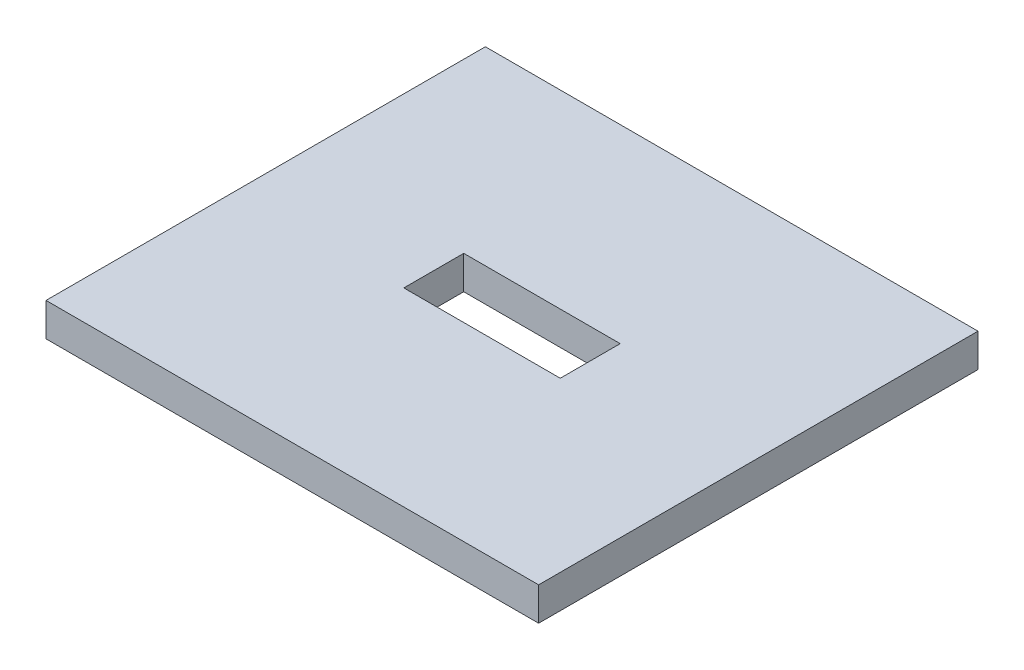
ISO-10303-21;
HEADER;
FILE_DESCRIPTION(('STEP AP214'),'2;1');
FILE_NAME('part.step','',(''),(''),'','','');
FILE_SCHEMA(('AUTOMOTIVE_DESIGN { 1 0 10303 214 1 1 1 1 }'));
ENDSEC;
DATA;
#1=APPLICATION_CONTEXT('core data for automotive mechanical design processes');
#2=APPLICATION_PROTOCOL_DEFINITION('international standard','automotive_design',2000,#1);
#3=PRODUCT_CONTEXT('',#1,'mechanical');
#4=PRODUCT('Part','Part','',(#3));
#5=PRODUCT_RELATED_PRODUCT_CATEGORY('part','',(#4));
#6=PRODUCT_DEFINITION_FORMATION('','',#4);
#7=PRODUCT_DEFINITION_CONTEXT('part definition',#1,'design');
#8=PRODUCT_DEFINITION('design','',#6,#7);
#9=PRODUCT_DEFINITION_SHAPE('','',#8);
#10=(LENGTH_UNIT() NAMED_UNIT(*) SI_UNIT(.MILLI.,.METRE.));
#11=(NAMED_UNIT(*) PLANE_ANGLE_UNIT() SI_UNIT($,.RADIAN.));
#12=(NAMED_UNIT(*) SI_UNIT($,.STERADIAN.) SOLID_ANGLE_UNIT());
#13=UNCERTAINTY_MEASURE_WITH_UNIT(LENGTH_MEASURE(1.E-05),#10,'distance_accuracy_value','');
#14=(GEOMETRIC_REPRESENTATION_CONTEXT(3) GLOBAL_UNCERTAINTY_ASSIGNED_CONTEXT((#13)) GLOBAL_UNIT_ASSIGNED_CONTEXT((#10,
#11,#12)) REPRESENTATION_CONTEXT('',''));
#15=CARTESIAN_POINT('',(0.,0.,0.));
#16=DIRECTION('',(0.,0.,1.));
#17=DIRECTION('',(1.,0.,0.));
#18=AXIS2_PLACEMENT_3D('',#15,#16,#17);
#19=CARTESIAN_POINT('',(0.,5.,0.));
#20=DIRECTION('',(0.,-1.,0.));
#21=DIRECTION('',(0.,0.,-1.));
#22=AXIS2_PLACEMENT_3D('',#19,#20,#21);
#23=PLANE('',#22);
#24=DIRECTION('',(0.,0.,1.));
#25=VECTOR('',#24,1.);
#26=CARTESIAN_POINT('',(0.,5.,0.));
#27=LINE('',#26,#25);
#28=CARTESIAN_POINT('',(0.,5.,-66.));
#29=VERTEX_POINT('',#28);
#30=CARTESIAN_POINT('',(0.,5.,0.));
#31=VERTEX_POINT('',#30);
#32=EDGE_CURVE('E134',#29,#31,#27,.T.);
#33=ORIENTED_EDGE('',*,*,#32,.T.);
#34=DIRECTION('',(1.,0.,0.));
#35=VECTOR('',#34,1.);
#36=CARTESIAN_POINT('',(0.,5.,0.));
#37=LINE('',#36,#35);
#38=CARTESIAN_POINT('',(74.,5.,0.));
#39=VERTEX_POINT('',#38);
#40=EDGE_CURVE('E137',#31,#39,#37,.T.);
#41=ORIENTED_EDGE('',*,*,#40,.T.);
#42=DIRECTION('',(0.,0.,-1.));
#43=VECTOR('',#42,1.);
#44=CARTESIAN_POINT('',(74.,5.,0.));
#45=LINE('',#44,#43);
#46=CARTESIAN_POINT('',(74.,5.,-66.));
#47=VERTEX_POINT('',#46);
#48=EDGE_CURVE('E140',#39,#47,#45,.T.);
#49=ORIENTED_EDGE('',*,*,#48,.T.);
#50=DIRECTION('',(-1.,0.,0.));
#51=VECTOR('',#50,1.);
#52=CARTESIAN_POINT('',(0.,5.,-66.));
#53=LINE('',#52,#51);
#54=EDGE_CURVE('E142',#47,#29,#53,.T.);
#55=ORIENTED_EDGE('',*,*,#54,.T.);
#56=EDGE_LOOP('',(#33,#41,#49,#55));
#57=FACE_BOUND('',#56,.T.);
#58=DIRECTION('',(0.,0.,1.));
#59=VECTOR('',#58,1.);
#60=CARTESIAN_POINT('',(25.25,5.,-37.5));
#61=LINE('',#60,#59);
#62=CARTESIAN_POINT('',(25.25,5.,-37.5));
#63=VERTEX_POINT('',#62);
#64=CARTESIAN_POINT('',(25.25,5.,-28.5));
#65=VERTEX_POINT('',#64);
#66=EDGE_CURVE('E98',#63,#65,#61,.T.);
#67=ORIENTED_EDGE('',*,*,#66,.F.);
#68=DIRECTION('',(-1.,0.,0.));
#69=VECTOR('',#68,1.);
#70=CARTESIAN_POINT('',(25.25,5.,-37.5));
#71=LINE('',#70,#69);
#72=CARTESIAN_POINT('',(48.75,5.,-37.5));
#73=VERTEX_POINT('',#72);
#74=EDGE_CURVE('E120',#73,#63,#71,.T.);
#75=ORIENTED_EDGE('',*,*,#74,.F.);
#76=DIRECTION('',(0.,0.,-1.));
#77=VECTOR('',#76,1.);
#78=CARTESIAN_POINT('',(48.75,5.,-37.5));
#79=LINE('',#78,#77);
#80=CARTESIAN_POINT('',(48.75,5.,-28.5));
#81=VERTEX_POINT('',#80);
#82=EDGE_CURVE('E118',#81,#73,#79,.T.);
#83=ORIENTED_EDGE('',*,*,#82,.F.);
#84=DIRECTION('',(1.,0.,0.));
#85=VECTOR('',#84,1.);
#86=CARTESIAN_POINT('',(25.25,5.,-28.5));
#87=LINE('',#86,#85);
#88=EDGE_CURVE('E106',#65,#81,#87,.T.);
#89=ORIENTED_EDGE('',*,*,#88,.F.);
#90=EDGE_LOOP('',(#67,#75,#83,#89));
#91=FACE_BOUND('',#90,.T.);
#92=ADVANCED_FACE('F33',(#57,#91),#23,.F.);
#93=CARTESIAN_POINT('',(0.,0.,0.));
#94=DIRECTION('',(0.,-1.,0.));
#95=DIRECTION('',(0.,0.,-1.));
#96=AXIS2_PLACEMENT_3D('',#93,#94,#95);
#97=PLANE('',#96);
#98=DIRECTION('',(0.,0.,1.));
#99=VECTOR('',#98,1.);
#100=CARTESIAN_POINT('',(0.,0.,0.));
#101=LINE('',#100,#99);
#102=CARTESIAN_POINT('',(0.,0.,-66.));
#103=VERTEX_POINT('',#102);
#104=CARTESIAN_POINT('',(0.,0.,0.));
#105=VERTEX_POINT('',#104);
#106=EDGE_CURVE('E114',#103,#105,#101,.T.);
#107=ORIENTED_EDGE('',*,*,#106,.F.);
#108=DIRECTION('',(-1.,0.,0.));
#109=VECTOR('',#108,1.);
#110=CARTESIAN_POINT('',(0.,0.,-66.));
#111=LINE('',#110,#109);
#112=CARTESIAN_POINT('',(74.,0.,-66.));
#113=VERTEX_POINT('',#112);
#114=EDGE_CURVE('E138',#113,#103,#111,.T.);
#115=ORIENTED_EDGE('',*,*,#114,.F.);
#116=DIRECTION('',(0.,0.,-1.));
#117=VECTOR('',#116,1.);
#118=CARTESIAN_POINT('',(74.,0.,0.));
#119=LINE('',#118,#117);
#120=CARTESIAN_POINT('',(74.,0.,0.));
#121=VERTEX_POINT('',#120);
#122=EDGE_CURVE('E149',#121,#113,#119,.T.);
#123=ORIENTED_EDGE('',*,*,#122,.F.);
#124=DIRECTION('',(1.,0.,0.));
#125=VECTOR('',#124,1.);
#126=CARTESIAN_POINT('',(0.,0.,0.));
#127=LINE('',#126,#125);
#128=EDGE_CURVE('E147',#105,#121,#127,.T.);
#129=ORIENTED_EDGE('',*,*,#128,.F.);
#130=EDGE_LOOP('',(#107,#115,#123,#129));
#131=FACE_BOUND('',#130,.T.);
#132=DIRECTION('',(-1.,0.,0.));
#133=VECTOR('',#132,1.);
#134=CARTESIAN_POINT('',(25.25,0.,-37.5));
#135=LINE('',#134,#133);
#136=CARTESIAN_POINT('',(48.75,0.,-37.5));
#137=VERTEX_POINT('',#136);
#138=CARTESIAN_POINT('',(25.25,0.,-37.5));
#139=VERTEX_POINT('',#138);
#140=EDGE_CURVE('E107',#137,#139,#135,.T.);
#141=ORIENTED_EDGE('',*,*,#140,.T.);
#142=DIRECTION('',(0.,0.,1.));
#143=VECTOR('',#142,1.);
#144=CARTESIAN_POINT('',(25.25,0.,-37.5));
#145=LINE('',#144,#143);
#146=CARTESIAN_POINT('',(25.25,0.,-28.5));
#147=VERTEX_POINT('',#146);
#148=EDGE_CURVE('E56',#139,#147,#145,.T.);
#149=ORIENTED_EDGE('',*,*,#148,.T.);
#150=DIRECTION('',(1.,0.,0.));
#151=VECTOR('',#150,1.);
#152=CARTESIAN_POINT('',(25.25,0.,-28.5));
#153=LINE('',#152,#151);
#154=CARTESIAN_POINT('',(48.75,0.,-28.5));
#155=VERTEX_POINT('',#154);
#156=EDGE_CURVE('E113',#147,#155,#153,.T.);
#157=ORIENTED_EDGE('',*,*,#156,.T.);
#158=DIRECTION('',(0.,0.,-1.));
#159=VECTOR('',#158,1.);
#160=CARTESIAN_POINT('',(48.75,0.,-37.5));
#161=LINE('',#160,#159);
#162=EDGE_CURVE('E126',#155,#137,#161,.T.);
#163=ORIENTED_EDGE('',*,*,#162,.T.);
#164=EDGE_LOOP('',(#141,#149,#157,#163));
#165=FACE_BOUND('',#164,.T.);
#166=ADVANCED_FACE('F167',(#131,#165),#97,.T.);
#167=CARTESIAN_POINT('',(0.,5.,0.));
#168=DIRECTION('',(1.,0.,0.));
#169=DIRECTION('',(0.,0.,-1.));
#170=AXIS2_PLACEMENT_3D('',#167,#168,#169);
#171=PLANE('',#170);
#172=ORIENTED_EDGE('',*,*,#106,.T.);
#173=DIRECTION('',(0.,-1.,0.));
#174=VECTOR('',#173,1.);
#175=CARTESIAN_POINT('',(0.,5.,0.));
#176=LINE('',#175,#174);
#177=EDGE_CURVE('E11',#31,#105,#176,.T.);
#178=ORIENTED_EDGE('',*,*,#177,.F.);
#179=ORIENTED_EDGE('',*,*,#32,.F.);
#180=DIRECTION('',(0.,-1.,0.));
#181=VECTOR('',#180,1.);
#182=CARTESIAN_POINT('',(0.,5.,-66.));
#183=LINE('',#182,#181);
#184=EDGE_CURVE('E144',#29,#103,#183,.T.);
#185=ORIENTED_EDGE('',*,*,#184,.T.);
#186=EDGE_LOOP('',(#172,#178,#179,#185));
#187=FACE_BOUND('',#186,.T.);
#188=ADVANCED_FACE('F35',(#187),#171,.F.);
#189=CARTESIAN_POINT('',(0.,5.,0.));
#190=DIRECTION('',(0.,0.,-1.));
#191=DIRECTION('',(-1.,0.,0.));
#192=AXIS2_PLACEMENT_3D('',#189,#190,#191);
#193=PLANE('',#192);
#194=ORIENTED_EDGE('',*,*,#128,.T.);
#195=DIRECTION('',(0.,-1.,0.));
#196=VECTOR('',#195,1.);
#197=CARTESIAN_POINT('',(74.,5.,0.));
#198=LINE('',#197,#196);
#199=EDGE_CURVE('E41',#39,#121,#198,.T.);
#200=ORIENTED_EDGE('',*,*,#199,.F.);
#201=ORIENTED_EDGE('',*,*,#40,.F.);
#202=ORIENTED_EDGE('',*,*,#177,.T.);
#203=EDGE_LOOP('',(#194,#200,#201,#202));
#204=FACE_BOUND('',#203,.T.);
#205=ADVANCED_FACE('F177',(#204),#193,.F.);
#206=CARTESIAN_POINT('',(74.,5.,0.));
#207=DIRECTION('',(-1.,0.,0.));
#208=DIRECTION('',(0.,0.,1.));
#209=AXIS2_PLACEMENT_3D('',#206,#207,#208);
#210=PLANE('',#209);
#211=ORIENTED_EDGE('',*,*,#122,.T.);
#212=DIRECTION('',(0.,-1.,0.));
#213=VECTOR('',#212,1.);
#214=CARTESIAN_POINT('',(74.,5.,-66.));
#215=LINE('',#214,#213);
#216=EDGE_CURVE('E154',#47,#113,#215,.T.);
#217=ORIENTED_EDGE('',*,*,#216,.F.);
#218=ORIENTED_EDGE('',*,*,#48,.F.);
#219=ORIENTED_EDGE('',*,*,#199,.T.);
#220=EDGE_LOOP('',(#211,#217,#218,#219));
#221=FACE_BOUND('',#220,.T.);
#222=ADVANCED_FACE('F161',(#221),#210,.F.);
#223=CARTESIAN_POINT('',(0.,5.,-66.));
#224=DIRECTION('',(0.,0.,1.));
#225=DIRECTION('',(1.,0.,0.));
#226=AXIS2_PLACEMENT_3D('',#223,#224,#225);
#227=PLANE('',#226);
#228=ORIENTED_EDGE('',*,*,#114,.T.);
#229=ORIENTED_EDGE('',*,*,#184,.F.);
#230=ORIENTED_EDGE('',*,*,#54,.F.);
#231=ORIENTED_EDGE('',*,*,#216,.T.);
#232=EDGE_LOOP('',(#228,#229,#230,#231));
#233=FACE_BOUND('',#232,.T.);
#234=ADVANCED_FACE('F171',(#233),#227,.F.);
#235=CARTESIAN_POINT('',(25.25,5.,-37.5));
#236=DIRECTION('',(1.,0.,0.));
#237=DIRECTION('',(0.,0.,-1.));
#238=AXIS2_PLACEMENT_3D('',#235,#236,#237);
#239=PLANE('',#238);
#240=ORIENTED_EDGE('',*,*,#148,.F.);
#241=DIRECTION('',(0.,-1.,0.));
#242=VECTOR('',#241,1.);
#243=CARTESIAN_POINT('',(25.25,5.,-37.5));
#244=LINE('',#243,#242);
#245=EDGE_CURVE('E102',#63,#139,#244,.T.);
#246=ORIENTED_EDGE('',*,*,#245,.F.);
#247=ORIENTED_EDGE('',*,*,#66,.T.);
#248=DIRECTION('',(0.,-1.,0.));
#249=VECTOR('',#248,1.);
#250=CARTESIAN_POINT('',(25.25,5.,-28.5));
#251=LINE('',#250,#249);
#252=EDGE_CURVE('E101',#65,#147,#251,.T.);
#253=ORIENTED_EDGE('',*,*,#252,.T.);
#254=EDGE_LOOP('',(#240,#246,#247,#253));
#255=FACE_BOUND('',#254,.T.);
#256=ADVANCED_FACE('F100',(#255),#239,.T.);
#257=CARTESIAN_POINT('',(25.25,5.,-28.5));
#258=DIRECTION('',(0.,0.,-1.));
#259=DIRECTION('',(-1.,0.,0.));
#260=AXIS2_PLACEMENT_3D('',#257,#258,#259);
#261=PLANE('',#260);
#262=ORIENTED_EDGE('',*,*,#156,.F.);
#263=ORIENTED_EDGE('',*,*,#252,.F.);
#264=ORIENTED_EDGE('',*,*,#88,.T.);
#265=DIRECTION('',(0.,-1.,0.));
#266=VECTOR('',#265,1.);
#267=CARTESIAN_POINT('',(48.75,5.,-28.5));
#268=LINE('',#267,#266);
#269=EDGE_CURVE('E115',#81,#155,#268,.T.);
#270=ORIENTED_EDGE('',*,*,#269,.T.);
#271=EDGE_LOOP('',(#262,#263,#264,#270));
#272=FACE_BOUND('',#271,.T.);
#273=ADVANCED_FACE('F110',(#272),#261,.T.);
#274=CARTESIAN_POINT('',(48.75,5.,-37.5));
#275=DIRECTION('',(-1.,0.,0.));
#276=DIRECTION('',(0.,0.,1.));
#277=AXIS2_PLACEMENT_3D('',#274,#275,#276);
#278=PLANE('',#277);
#279=ORIENTED_EDGE('',*,*,#162,.F.);
#280=ORIENTED_EDGE('',*,*,#269,.F.);
#281=ORIENTED_EDGE('',*,*,#82,.T.);
#282=DIRECTION('',(0.,-1.,0.));
#283=VECTOR('',#282,1.);
#284=CARTESIAN_POINT('',(48.75,5.,-37.5));
#285=LINE('',#284,#283);
#286=EDGE_CURVE('E48',#73,#137,#285,.T.);
#287=ORIENTED_EDGE('',*,*,#286,.T.);
#288=EDGE_LOOP('',(#279,#280,#281,#287));
#289=FACE_BOUND('',#288,.T.);
#290=ADVANCED_FACE('F200',(#289),#278,.T.);
#291=CARTESIAN_POINT('',(25.25,5.,-37.5));
#292=DIRECTION('',(0.,0.,1.));
#293=DIRECTION('',(1.,0.,0.));
#294=AXIS2_PLACEMENT_3D('',#291,#292,#293);
#295=PLANE('',#294);
#296=ORIENTED_EDGE('',*,*,#140,.F.);
#297=ORIENTED_EDGE('',*,*,#286,.F.);
#298=ORIENTED_EDGE('',*,*,#74,.T.);
#299=ORIENTED_EDGE('',*,*,#245,.T.);
#300=EDGE_LOOP('',(#296,#297,#298,#299));
#301=FACE_BOUND('',#300,.T.);
#302=ADVANCED_FACE('F204',(#301),#295,.T.);
#303=CLOSED_SHELL('',(#92,#166,#188,#205,#222,#234,#256,#273,#290,#302));
#304=MANIFOLD_SOLID_BREP('B2',#303);
#305=ADVANCED_BREP_SHAPE_REPRESENTATION('',(#18,#304),#14);
#306=SHAPE_DEFINITION_REPRESENTATION(#9,#305);
ENDSEC;
END-ISO-10303-21;
